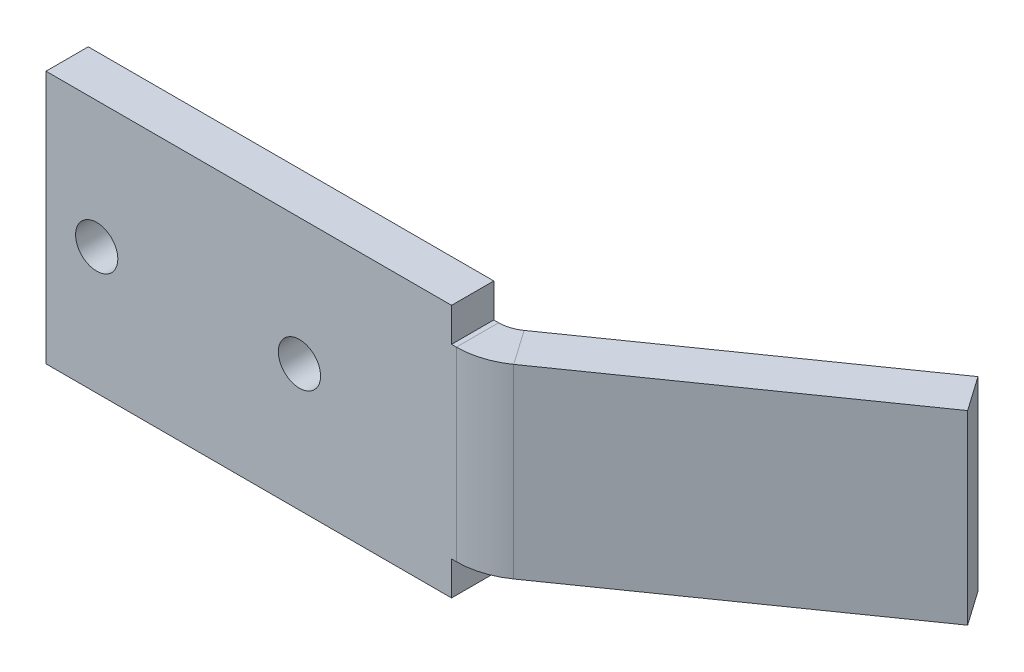
ISO-10303-21;
HEADER;
FILE_DESCRIPTION(('STEP AP214'),'2;1');
FILE_NAME('part.step','',(''),(''),'','','');
FILE_SCHEMA(('AUTOMOTIVE_DESIGN { 1 0 10303 214 1 1 1 1 }'));
ENDSEC;
DATA;
#1=APPLICATION_CONTEXT('core data for automotive mechanical design processes');
#2=APPLICATION_PROTOCOL_DEFINITION('international standard','automotive_design',2000,#1);
#3=PRODUCT_CONTEXT('',#1,'mechanical');
#4=PRODUCT('Part','Part','',(#3));
#5=PRODUCT_RELATED_PRODUCT_CATEGORY('part','',(#4));
#6=PRODUCT_DEFINITION_FORMATION('','',#4);
#7=PRODUCT_DEFINITION_CONTEXT('part definition',#1,'design');
#8=PRODUCT_DEFINITION('design','',#6,#7);
#9=PRODUCT_DEFINITION_SHAPE('','',#8);
#10=(LENGTH_UNIT() NAMED_UNIT(*) SI_UNIT(.MILLI.,.METRE.));
#11=(NAMED_UNIT(*) PLANE_ANGLE_UNIT() SI_UNIT($,.RADIAN.));
#12=(NAMED_UNIT(*) SI_UNIT($,.STERADIAN.) SOLID_ANGLE_UNIT());
#13=UNCERTAINTY_MEASURE_WITH_UNIT(LENGTH_MEASURE(1.E-05),#10,'distance_accuracy_value','');
#14=(GEOMETRIC_REPRESENTATION_CONTEXT(3) GLOBAL_UNCERTAINTY_ASSIGNED_CONTEXT((#13)) GLOBAL_UNIT_ASSIGNED_CONTEXT((#10,
#11,#12)) REPRESENTATION_CONTEXT('',''));
#15=CARTESIAN_POINT('',(0.,0.,0.));
#16=DIRECTION('',(0.,0.,1.));
#17=DIRECTION('',(1.,0.,0.));
#18=AXIS2_PLACEMENT_3D('',#15,#16,#17);
#19=CARTESIAN_POINT('',(6.62285312828795,15.,13.3614630847976));
#20=DIRECTION('',(-0.573576436351047,0.,-0.819152044288991));
#21=DIRECTION('',(-0.819152044288991,0.,0.573576436351047));
#22=AXIS2_PLACEMENT_3D('',#19,#20,#21);
#23=PLANE('',#22);
#24=DIRECTION('',(-0.819152044288991,0.,0.573576436351047));
#25=VECTOR('',#24,1.);
#26=CARTESIAN_POINT('',(26.2825021912237,13.,-0.40437138762749));
#27=LINE('',#26,#25);
#28=CARTESIAN_POINT('',(42.6655430770036,13.,-11.8759001146484));
#29=VERTEX_POINT('',#28);
#30=CARTESIAN_POINT('',(26.8672494136243,13.,-0.813815800699542));
#31=VERTEX_POINT('',#30);
#32=EDGE_CURVE('E57',#29,#31,#27,.T.);
#33=ORIENTED_EDGE('',*,*,#32,.T.);
#34=DIRECTION('',(0.,-1.,0.));
#35=VECTOR('',#34,1.);
#36=CARTESIAN_POINT('',(26.8672494136243,15.,-0.813815800699542));
#37=LINE('',#36,#35);
#38=CARTESIAN_POINT('',(26.8672494136243,2.,-0.813815800699542));
#39=VERTEX_POINT('',#38);
#40=EDGE_CURVE('E49',#31,#39,#37,.T.);
#41=ORIENTED_EDGE('',*,*,#40,.T.);
#42=DIRECTION('',(0.819152044288991,0.,-0.573576436351047));
#43=VECTOR('',#42,1.);
#44=CARTESIAN_POINT('',(26.2825021912237,2.,-0.40437138762749));
#45=LINE('',#44,#43);
#46=CARTESIAN_POINT('',(42.6655430770036,2.,-11.8759001146484));
#47=VERTEX_POINT('',#46);
#48=EDGE_CURVE('E65',#39,#47,#45,.T.);
#49=ORIENTED_EDGE('',*,*,#48,.T.);
#50=DIRECTION('',(0.,1.,0.));
#51=VECTOR('',#50,1.);
#52=CARTESIAN_POINT('',(42.6655430770036,2.,-11.8759001146484));
#53=LINE('',#52,#51);
#54=EDGE_CURVE('E212',#47,#29,#53,.T.);
#55=ORIENTED_EDGE('',*,*,#54,.T.);
#56=EDGE_LOOP('',(#33,#41,#49,#55));
#57=FACE_BOUND('',#56,.T.);
#58=ADVANCED_FACE('F40',(#57),#23,.F.);
#59=CARTESIAN_POINT('',(24.8485611003461,13.,-2.45225149834997));
#60=DIRECTION('',(0.,1.,0.));
#61=DIRECTION('',(0.573576436351047,0.,0.819152044288991));
#62=AXIS2_PLACEMENT_3D('',#59,#60,#61);
#63=PLANE('',#62);
#64=DIRECTION('',(-0.573576436351047,0.,-0.819152044288991));
#65=VECTOR('',#64,1.);
#66=CARTESIAN_POINT('',(25.4333083227467,13.,-2.86169591142202));
#67=LINE('',#66,#65);
#68=CARTESIAN_POINT('',(25.4333083227467,13.,-2.86169591142202));
#69=VERTEX_POINT('',#68);
#70=EDGE_CURVE('E12',#31,#69,#67,.T.);
#71=ORIENTED_EDGE('',*,*,#70,.F.);
#72=ORIENTED_EDGE('',*,*,#32,.F.);
#73=DIRECTION('',(0.573576436351047,0.,0.819152044288991));
#74=VECTOR('',#73,1.);
#75=CARTESIAN_POINT('',(41.2316019861259,13.,-13.9237802253709));
#76=LINE('',#75,#74);
#77=CARTESIAN_POINT('',(41.2316019861259,13.,-13.9237802253709));
#78=VERTEX_POINT('',#77);
#79=EDGE_CURVE('E214',#78,#29,#76,.T.);
#80=ORIENTED_EDGE('',*,*,#79,.F.);
#81=DIRECTION('',(-0.819152044288991,0.,0.573576436351047));
#82=VECTOR('',#81,1.);
#83=CARTESIAN_POINT('',(24.8485611003461,13.,-2.45225149834997));
#84=LINE('',#83,#82);
#85=EDGE_CURVE('E211',#78,#69,#84,.T.);
#86=ORIENTED_EDGE('',*,*,#85,.T.);
#87=EDGE_LOOP('',(#71,#72,#80,#86));
#88=FACE_BOUND('',#87,.T.);
#89=ADVANCED_FACE('F42',(#88),#63,.T.);
#90=CARTESIAN_POINT('',(41.2316019861259,2.,-13.9237802253709));
#91=DIRECTION('',(0.819152044288991,0.,-0.573576436351047));
#92=DIRECTION('',(-0.573576436351047,0.,-0.819152044288991));
#93=AXIS2_PLACEMENT_3D('',#90,#91,#92);
#94=PLANE('',#93);
#95=ORIENTED_EDGE('',*,*,#54,.F.);
#96=DIRECTION('',(0.573576436351047,0.,0.819152044288991));
#97=VECTOR('',#96,1.);
#98=CARTESIAN_POINT('',(41.2316019861259,2.,-13.9237802253709));
#99=LINE('',#98,#97);
#100=CARTESIAN_POINT('',(41.2316019861259,2.,-13.9237802253709));
#101=VERTEX_POINT('',#100);
#102=EDGE_CURVE('E216',#101,#47,#99,.T.);
#103=ORIENTED_EDGE('',*,*,#102,.F.);
#104=DIRECTION('',(0.,1.,0.));
#105=VECTOR('',#104,1.);
#106=CARTESIAN_POINT('',(41.2316019861259,2.,-13.9237802253709));
#107=LINE('',#106,#105);
#108=EDGE_CURVE('E208',#101,#78,#107,.T.);
#109=ORIENTED_EDGE('',*,*,#108,.T.);
#110=ORIENTED_EDGE('',*,*,#79,.T.);
#111=EDGE_LOOP('',(#95,#103,#109,#110));
#112=FACE_BOUND('',#111,.T.);
#113=ADVANCED_FACE('F232',(#112),#94,.T.);
#114=CARTESIAN_POINT('',(24.8485611003461,2.,-2.45225149834997));
#115=DIRECTION('',(0.,-1.,0.));
#116=DIRECTION('',(-0.573576436351047,0.,-0.819152044288991));
#117=AXIS2_PLACEMENT_3D('',#114,#115,#116);
#118=PLANE('',#117);
#119=DIRECTION('',(0.573576436351047,0.,0.819152044288991));
#120=VECTOR('',#119,1.);
#121=CARTESIAN_POINT('',(25.4333083227467,2.,-2.86169591142202));
#122=LINE('',#121,#120);
#123=CARTESIAN_POINT('',(25.4333083227467,2.,-2.86169591142202));
#124=VERTEX_POINT('',#123);
#125=EDGE_CURVE('E219',#124,#39,#122,.T.);
#126=ORIENTED_EDGE('',*,*,#125,.F.);
#127=DIRECTION('',(0.819152044288991,0.,-0.573576436351047));
#128=VECTOR('',#127,1.);
#129=CARTESIAN_POINT('',(24.8485611003461,2.,-2.45225149834997));
#130=LINE('',#129,#128);
#131=EDGE_CURVE('E44',#124,#101,#130,.T.);
#132=ORIENTED_EDGE('',*,*,#131,.T.);
#133=ORIENTED_EDGE('',*,*,#102,.T.);
#134=ORIENTED_EDGE('',*,*,#48,.F.);
#135=EDGE_LOOP('',(#126,#132,#133,#134));
#136=FACE_BOUND('',#135,.T.);
#137=ADVANCED_FACE('F227',(#136),#118,.T.);
#138=CARTESIAN_POINT('',(5.18891203741034,15.,11.3135829740752));
#139=DIRECTION('',(-0.573576436351047,0.,-0.819152044288991));
#140=DIRECTION('',(-0.819152044288991,0.,0.573576436351047));
#141=AXIS2_PLACEMENT_3D('',#138,#139,#140);
#142=PLANE('',#141);
#143=DIRECTION('',(0.,-1.,0.));
#144=VECTOR('',#143,1.);
#145=CARTESIAN_POINT('',(25.4333083227467,15.,-2.86169591142202));
#146=LINE('',#145,#144);
#147=EDGE_CURVE('E153',#69,#124,#146,.T.);
#148=ORIENTED_EDGE('',*,*,#147,.F.);
#149=ORIENTED_EDGE('',*,*,#85,.F.);
#150=ORIENTED_EDGE('',*,*,#108,.F.);
#151=ORIENTED_EDGE('',*,*,#131,.F.);
#152=EDGE_LOOP('',(#148,#149,#150,#151));
#153=FACE_BOUND('',#152,.T.);
#154=ADVANCED_FACE('F234',(#153),#142,.T.);
#155=CARTESIAN_POINT('',(24.,15.,-2.5));
#156=DIRECTION('',(1.,0.,0.));
#157=DIRECTION('',(0.,0.,-1.));
#158=AXIS2_PLACEMENT_3D('',#155,#156,#157);
#159=PLANE('',#158);
#160=DIRECTION('',(0.,1.,0.));
#161=VECTOR('',#160,1.);
#162=CARTESIAN_POINT('',(24.,15.,0.));
#163=LINE('',#162,#161);
#164=CARTESIAN_POINT('',(24.,13.,0.));
#165=VERTEX_POINT('',#164);
#166=CARTESIAN_POINT('',(24.,15.,0.));
#167=VERTEX_POINT('',#166);
#168=EDGE_CURVE('E266',#165,#167,#163,.T.);
#169=ORIENTED_EDGE('',*,*,#168,.F.);
#170=DIRECTION('',(0.,0.,1.));
#171=VECTOR('',#170,1.);
#172=CARTESIAN_POINT('',(24.,13.,-2.5));
#173=LINE('',#172,#171);
#174=CARTESIAN_POINT('',(24.,13.,-2.5));
#175=VERTEX_POINT('',#174);
#176=EDGE_CURVE('E224',#175,#165,#173,.T.);
#177=ORIENTED_EDGE('',*,*,#176,.F.);
#178=DIRECTION('',(0.,1.,0.));
#179=VECTOR('',#178,1.);
#180=CARTESIAN_POINT('',(24.,15.,-2.5));
#181=LINE('',#180,#179);
#182=CARTESIAN_POINT('',(24.,15.,-2.5));
#183=VERTEX_POINT('',#182);
#184=EDGE_CURVE('E204',#175,#183,#181,.T.);
#185=ORIENTED_EDGE('',*,*,#184,.T.);
#186=DIRECTION('',(0.,0.,1.));
#187=VECTOR('',#186,1.);
#188=CARTESIAN_POINT('',(24.,15.,-2.5));
#189=LINE('',#188,#187);
#190=EDGE_CURVE('E202',#183,#167,#189,.T.);
#191=ORIENTED_EDGE('',*,*,#190,.T.);
#192=EDGE_LOOP('',(#169,#177,#185,#191));
#193=FACE_BOUND('',#192,.T.);
#194=ADVANCED_FACE('F279',(#193),#159,.T.);
#195=CARTESIAN_POINT('',(0.,15.,-2.5));
#196=DIRECTION('',(0.,1.,0.));
#197=DIRECTION('',(0.,0.,1.));
#198=AXIS2_PLACEMENT_3D('',#195,#196,#197);
#199=PLANE('',#198);
#200=DIRECTION('',(-1.,0.,0.));
#201=VECTOR('',#200,1.);
#202=CARTESIAN_POINT('',(0.,15.,0.));
#203=LINE('',#202,#201);
#204=CARTESIAN_POINT('',(0.,15.,0.));
#205=VERTEX_POINT('',#204);
#206=EDGE_CURVE('E263',#167,#205,#203,.T.);
#207=ORIENTED_EDGE('',*,*,#206,.F.);
#208=ORIENTED_EDGE('',*,*,#190,.F.);
#209=DIRECTION('',(-1.,0.,0.));
#210=VECTOR('',#209,1.);
#211=CARTESIAN_POINT('',(0.,15.,-2.5));
#212=LINE('',#211,#210);
#213=CARTESIAN_POINT('',(0.,15.,-2.5));
#214=VERTEX_POINT('',#213);
#215=EDGE_CURVE('E199',#183,#214,#212,.T.);
#216=ORIENTED_EDGE('',*,*,#215,.T.);
#217=DIRECTION('',(0.,0.,1.));
#218=VECTOR('',#217,1.);
#219=CARTESIAN_POINT('',(0.,15.,-2.5));
#220=LINE('',#219,#218);
#221=EDGE_CURVE('E197',#214,#205,#220,.T.);
#222=ORIENTED_EDGE('',*,*,#221,.T.);
#223=EDGE_LOOP('',(#207,#208,#216,#222));
#224=FACE_BOUND('',#223,.T.);
#225=ADVANCED_FACE('F282',(#224),#199,.T.);
#226=CARTESIAN_POINT('',(0.,0.,-2.5));
#227=DIRECTION('',(-1.,0.,0.));
#228=DIRECTION('',(0.,0.,1.));
#229=AXIS2_PLACEMENT_3D('',#226,#227,#228);
#230=PLANE('',#229);
#231=DIRECTION('',(0.,-1.,0.));
#232=VECTOR('',#231,1.);
#233=CARTESIAN_POINT('',(0.,0.,0.));
#234=LINE('',#233,#232);
#235=CARTESIAN_POINT('',(0.,0.,0.));
#236=VERTEX_POINT('',#235);
#237=EDGE_CURVE('E260',#205,#236,#234,.T.);
#238=ORIENTED_EDGE('',*,*,#237,.F.);
#239=ORIENTED_EDGE('',*,*,#221,.F.);
#240=DIRECTION('',(0.,-1.,0.));
#241=VECTOR('',#240,1.);
#242=CARTESIAN_POINT('',(0.,0.,-2.5));
#243=LINE('',#242,#241);
#244=CARTESIAN_POINT('',(0.,0.,-2.5));
#245=VERTEX_POINT('',#244);
#246=EDGE_CURVE('E194',#214,#245,#243,.T.);
#247=ORIENTED_EDGE('',*,*,#246,.T.);
#248=DIRECTION('',(0.,0.,1.));
#249=VECTOR('',#248,1.);
#250=CARTESIAN_POINT('',(0.,0.,-2.5));
#251=LINE('',#250,#249);
#252=EDGE_CURVE('E192',#245,#236,#251,.T.);
#253=ORIENTED_EDGE('',*,*,#252,.T.);
#254=EDGE_LOOP('',(#238,#239,#247,#253));
#255=FACE_BOUND('',#254,.T.);
#256=ADVANCED_FACE('F286',(#255),#230,.T.);
#257=CARTESIAN_POINT('',(0.,0.,-2.5));
#258=DIRECTION('',(0.,-1.,0.));
#259=DIRECTION('',(0.,0.,-1.));
#260=AXIS2_PLACEMENT_3D('',#257,#258,#259);
#261=PLANE('',#260);
#262=DIRECTION('',(1.,0.,0.));
#263=VECTOR('',#262,1.);
#264=CARTESIAN_POINT('',(0.,0.,0.));
#265=LINE('',#264,#263);
#266=CARTESIAN_POINT('',(24.,0.,0.));
#267=VERTEX_POINT('',#266);
#268=EDGE_CURVE('E257',#236,#267,#265,.T.);
#269=ORIENTED_EDGE('',*,*,#268,.F.);
#270=ORIENTED_EDGE('',*,*,#252,.F.);
#271=DIRECTION('',(1.,0.,0.));
#272=VECTOR('',#271,1.);
#273=CARTESIAN_POINT('',(0.,0.,-2.5));
#274=LINE('',#273,#272);
#275=CARTESIAN_POINT('',(24.,0.,-2.5));
#276=VERTEX_POINT('',#275);
#277=EDGE_CURVE('E189',#245,#276,#274,.T.);
#278=ORIENTED_EDGE('',*,*,#277,.T.);
#279=DIRECTION('',(0.,0.,1.));
#280=VECTOR('',#279,1.);
#281=CARTESIAN_POINT('',(24.,0.,-2.5));
#282=LINE('',#281,#280);
#283=EDGE_CURVE('E187',#276,#267,#282,.T.);
#284=ORIENTED_EDGE('',*,*,#283,.T.);
#285=EDGE_LOOP('',(#269,#270,#278,#284));
#286=FACE_BOUND('',#285,.T.);
#287=ADVANCED_FACE('F290',(#286),#261,.T.);
#288=CARTESIAN_POINT('',(24.,0.,-2.5));
#289=DIRECTION('',(1.,0.,0.));
#290=DIRECTION('',(0.,0.,-1.));
#291=AXIS2_PLACEMENT_3D('',#288,#289,#290);
#292=PLANE('',#291);
#293=DIRECTION('',(0.,1.,0.));
#294=VECTOR('',#293,1.);
#295=CARTESIAN_POINT('',(24.,0.,0.));
#296=LINE('',#295,#294);
#297=CARTESIAN_POINT('',(24.,2.,0.));
#298=VERTEX_POINT('',#297);
#299=EDGE_CURVE('E254',#267,#298,#296,.T.);
#300=ORIENTED_EDGE('',*,*,#299,.F.);
#301=ORIENTED_EDGE('',*,*,#283,.F.);
#302=DIRECTION('',(0.,1.,0.));
#303=VECTOR('',#302,1.);
#304=CARTESIAN_POINT('',(24.,0.,-2.5));
#305=LINE('',#304,#303);
#306=CARTESIAN_POINT('',(24.,2.,-2.5));
#307=VERTEX_POINT('',#306);
#308=EDGE_CURVE('E185',#276,#307,#305,.T.);
#309=ORIENTED_EDGE('',*,*,#308,.T.);
#310=DIRECTION('',(0.,0.,1.));
#311=VECTOR('',#310,1.);
#312=CARTESIAN_POINT('',(24.,2.,-2.5));
#313=LINE('',#312,#311);
#314=EDGE_CURVE('E169',#307,#298,#313,.T.);
#315=ORIENTED_EDGE('',*,*,#314,.T.);
#316=EDGE_LOOP('',(#300,#301,#309,#315));
#317=FACE_BOUND('',#316,.T.);
#318=ADVANCED_FACE('F293',(#317),#292,.T.);
#319=CARTESIAN_POINT('',(15.,7.5,0.));
#320=DIRECTION('',(0.,0.,1.));
#321=DIRECTION('',(1.,0.,0.));
#322=AXIS2_PLACEMENT_3D('',#319,#320,#321);
#323=CYLINDRICAL_SURFACE('',#322,1.25);
#324=CARTESIAN_POINT('',(15.,7.5,-2.5));
#325=DIRECTION('',(0.,0.,-1.));
#326=DIRECTION('',(-1.,0.,0.));
#327=AXIS2_PLACEMENT_3D('',#324,#325,#326);
#328=CIRCLE('',#327,1.25);
#329=CARTESIAN_POINT('',(13.75,7.5,-2.5));
#330=VERTEX_POINT('',#329);
#331=EDGE_CURVE('E181',#330,#330,#328,.T.);
#332=ORIENTED_EDGE('',*,*,#331,.T.);
#333=EDGE_LOOP('',(#332));
#334=FACE_BOUND('',#333,.T.);
#335=CARTESIAN_POINT('',(15.,7.5,0.));
#336=DIRECTION('',(0.,0.,1.));
#337=DIRECTION('',(1.,0.,0.));
#338=AXIS2_PLACEMENT_3D('',#335,#336,#337);
#339=CIRCLE('',#338,1.25);
#340=CARTESIAN_POINT('',(16.25,7.5,0.));
#341=VERTEX_POINT('',#340);
#342=EDGE_CURVE('E178',#341,#341,#339,.T.);
#343=ORIENTED_EDGE('',*,*,#342,.T.);
#344=EDGE_LOOP('',(#343));
#345=FACE_BOUND('',#344,.T.);
#346=ADVANCED_FACE('F295',(#334,#345),#323,.F.);
#347=CARTESIAN_POINT('',(3.,7.5,0.));
#348=DIRECTION('',(0.,0.,1.));
#349=DIRECTION('',(1.,0.,0.));
#350=AXIS2_PLACEMENT_3D('',#347,#348,#349);
#351=CYLINDRICAL_SURFACE('',#350,1.25);
#352=CARTESIAN_POINT('',(3.,7.5,-2.5));
#353=DIRECTION('',(0.,0.,-1.));
#354=DIRECTION('',(-1.,0.,0.));
#355=AXIS2_PLACEMENT_3D('',#352,#353,#354);
#356=CIRCLE('',#355,1.25);
#357=CARTESIAN_POINT('',(1.75,7.5,-2.5));
#358=VERTEX_POINT('',#357);
#359=EDGE_CURVE('E175',#358,#358,#356,.T.);
#360=ORIENTED_EDGE('',*,*,#359,.T.);
#361=EDGE_LOOP('',(#360));
#362=FACE_BOUND('',#361,.T.);
#363=CARTESIAN_POINT('',(3.,7.5,0.));
#364=DIRECTION('',(0.,0.,1.));
#365=DIRECTION('',(1.,0.,0.));
#366=AXIS2_PLACEMENT_3D('',#363,#364,#365);
#367=CIRCLE('',#366,1.25);
#368=CARTESIAN_POINT('',(4.25,7.5,0.));
#369=VERTEX_POINT('',#368);
#370=EDGE_CURVE('E166',#369,#369,#367,.T.);
#371=ORIENTED_EDGE('',*,*,#370,.T.);
#372=EDGE_LOOP('',(#371));
#373=FACE_BOUND('',#372,.T.);
#374=ADVANCED_FACE('F301',(#362,#373),#351,.F.);
#375=CARTESIAN_POINT('',(0.,15.,-2.5));
#376=DIRECTION('',(0.,0.,-1.));
#377=DIRECTION('',(-1.,0.,0.));
#378=AXIS2_PLACEMENT_3D('',#375,#376,#377);
#379=PLANE('',#378);
#380=ORIENTED_EDGE('',*,*,#359,.F.);
#381=EDGE_LOOP('',(#380));
#382=FACE_BOUND('',#381,.T.);
#383=ORIENTED_EDGE('',*,*,#331,.F.);
#384=EDGE_LOOP('',(#383));
#385=FACE_BOUND('',#384,.T.);
#386=DIRECTION('',(-1.,0.,0.));
#387=VECTOR('',#386,1.);
#388=CARTESIAN_POINT('',(24.,13.,-2.5));
#389=LINE('',#388,#387);
#390=CARTESIAN_POINT('',(24.2861554500446,13.,-2.5));
#391=VERTEX_POINT('',#390);
#392=EDGE_CURVE('E164',#391,#175,#389,.T.);
#393=ORIENTED_EDGE('',*,*,#392,.F.);
#394=DIRECTION('',(0.,-1.,0.));
#395=VECTOR('',#394,1.);
#396=CARTESIAN_POINT('',(24.2861554500446,15.,-2.5));
#397=LINE('',#396,#395);
#398=CARTESIAN_POINT('',(24.2861554500446,2.,-2.5));
#399=VERTEX_POINT('',#398);
#400=EDGE_CURVE('E151',#391,#399,#397,.T.);
#401=ORIENTED_EDGE('',*,*,#400,.T.);
#402=DIRECTION('',(1.,0.,0.));
#403=VECTOR('',#402,1.);
#404=CARTESIAN_POINT('',(24.,2.,-2.5));
#405=LINE('',#404,#403);
#406=EDGE_CURVE('E144',#307,#399,#405,.T.);
#407=ORIENTED_EDGE('',*,*,#406,.F.);
#408=ORIENTED_EDGE('',*,*,#308,.F.);
#409=ORIENTED_EDGE('',*,*,#277,.F.);
#410=ORIENTED_EDGE('',*,*,#246,.F.);
#411=ORIENTED_EDGE('',*,*,#215,.F.);
#412=ORIENTED_EDGE('',*,*,#184,.F.);
#413=EDGE_LOOP('',(#393,#401,#407,#408,#409,#410,#411,#412));
#414=FACE_BOUND('',#413,.T.);
#415=ADVANCED_FACE('F160',(#382,#385,#414),#379,.T.);
#416=CARTESIAN_POINT('',(24.,2.,-2.5));
#417=DIRECTION('',(0.,-1.,0.));
#418=DIRECTION('',(0.,0.,-1.));
#419=AXIS2_PLACEMENT_3D('',#416,#417,#418);
#420=PLANE('',#419);
#421=ORIENTED_EDGE('',*,*,#406,.T.);
#422=DIRECTION('',(0.,0.,1.));
#423=VECTOR('',#422,1.);
#424=CARTESIAN_POINT('',(24.2861554500446,2.,-2.5));
#425=LINE('',#424,#423);
#426=CARTESIAN_POINT('',(24.2861554500446,2.,0.));
#427=VERTEX_POINT('',#426);
#428=EDGE_CURVE('E132',#399,#427,#425,.T.);
#429=ORIENTED_EDGE('',*,*,#428,.T.);
#430=DIRECTION('',(1.,0.,0.));
#431=VECTOR('',#430,1.);
#432=CARTESIAN_POINT('',(24.,2.,0.));
#433=LINE('',#432,#431);
#434=EDGE_CURVE('E251',#298,#427,#433,.T.);
#435=ORIENTED_EDGE('',*,*,#434,.F.);
#436=ORIENTED_EDGE('',*,*,#314,.F.);
#437=EDGE_LOOP('',(#421,#429,#435,#436));
#438=FACE_BOUND('',#437,.T.);
#439=ADVANCED_FACE('F168',(#438),#420,.T.);
#440=CARTESIAN_POINT('',(0.,15.,0.));
#441=DIRECTION('',(0.,0.,-1.));
#442=DIRECTION('',(-1.,0.,0.));
#443=AXIS2_PLACEMENT_3D('',#440,#441,#442);
#444=PLANE('',#443);
#445=DIRECTION('',(0.,-1.,0.));
#446=VECTOR('',#445,1.);
#447=CARTESIAN_POINT('',(24.2861554500446,15.,0.));
#448=LINE('',#447,#446);
#449=CARTESIAN_POINT('',(24.2861554500446,13.,0.));
#450=VERTEX_POINT('',#449);
#451=EDGE_CURVE('E154',#450,#427,#448,.T.);
#452=ORIENTED_EDGE('',*,*,#451,.F.);
#453=DIRECTION('',(-1.,0.,0.));
#454=VECTOR('',#453,1.);
#455=CARTESIAN_POINT('',(24.,13.,0.));
#456=LINE('',#455,#454);
#457=EDGE_CURVE('E143',#450,#165,#456,.T.);
#458=ORIENTED_EDGE('',*,*,#457,.T.);
#459=ORIENTED_EDGE('',*,*,#168,.T.);
#460=ORIENTED_EDGE('',*,*,#206,.T.);
#461=ORIENTED_EDGE('',*,*,#237,.T.);
#462=ORIENTED_EDGE('',*,*,#268,.T.);
#463=ORIENTED_EDGE('',*,*,#299,.T.);
#464=ORIENTED_EDGE('',*,*,#434,.T.);
#465=EDGE_LOOP('',(#452,#458,#459,#460,#461,#462,#463,#464));
#466=FACE_BOUND('',#465,.T.);
#467=ORIENTED_EDGE('',*,*,#370,.F.);
#468=EDGE_LOOP('',(#467));
#469=FACE_BOUND('',#468,.T.);
#470=ORIENTED_EDGE('',*,*,#342,.F.);
#471=EDGE_LOOP('',(#470));
#472=FACE_BOUND('',#471,.T.);
#473=ADVANCED_FACE('F271',(#466,#469,#472),#444,.F.);
#474=CARTESIAN_POINT('',(24.,13.,-2.5));
#475=DIRECTION('',(0.,1.,0.));
#476=DIRECTION('',(0.,0.,1.));
#477=AXIS2_PLACEMENT_3D('',#474,#475,#476);
#478=PLANE('',#477);
#479=ORIENTED_EDGE('',*,*,#457,.F.);
#480=DIRECTION('',(0.,0.,-1.));
#481=VECTOR('',#480,1.);
#482=CARTESIAN_POINT('',(24.2861554500446,13.,-2.5));
#483=LINE('',#482,#481);
#484=EDGE_CURVE('E249',#450,#391,#483,.T.);
#485=ORIENTED_EDGE('',*,*,#484,.T.);
#486=ORIENTED_EDGE('',*,*,#392,.T.);
#487=ORIENTED_EDGE('',*,*,#176,.T.);
#488=EDGE_LOOP('',(#479,#485,#486,#487));
#489=FACE_BOUND('',#488,.T.);
#490=ADVANCED_FACE('F277',(#489),#478,.T.);
#491=CARTESIAN_POINT('',(24.2861554500446,13.,-4.5));
#492=DIRECTION('',(0.,-1.,0.));
#493=DIRECTION('',(0.,0.,-1.));
#494=AXIS2_PLACEMENT_3D('',#491,#492,#493);
#495=PLANE('',#494);
#496=ORIENTED_EDGE('',*,*,#484,.F.);
#497=CARTESIAN_POINT('',(24.2861554500446,13.,-4.5));
#498=DIRECTION('',(0.,-1.,0.));
#499=DIRECTION('',(0.,0.,-1.));
#500=AXIS2_PLACEMENT_3D('',#497,#498,#499);
#501=CIRCLE('',#500,4.5);
#502=EDGE_CURVE('E241',#450,#31,#501,.F.);
#503=ORIENTED_EDGE('',*,*,#502,.T.);
#504=ORIENTED_EDGE('',*,*,#70,.T.);
#505=CARTESIAN_POINT('',(24.2861554500446,13.,-4.5));
#506=DIRECTION('',(0.,1.,0.));
#507=DIRECTION('',(0.,0.,-1.));
#508=AXIS2_PLACEMENT_3D('',#505,#506,#507);
#509=CIRCLE('',#508,2.);
#510=EDGE_CURVE('E155',#391,#69,#509,.T.);
#511=ORIENTED_EDGE('',*,*,#510,.F.);
#512=EDGE_LOOP('',(#496,#503,#504,#511));
#513=FACE_BOUND('',#512,.T.);
#514=ADVANCED_FACE('F239',(#513),#495,.F.);
#515=CARTESIAN_POINT('',(24.2861554500446,2.,-4.5));
#516=DIRECTION('',(0.,1.,0.));
#517=DIRECTION('',(0.,0.,1.));
#518=AXIS2_PLACEMENT_3D('',#515,#516,#517);
#519=PLANE('',#518);
#520=CARTESIAN_POINT('',(24.2861554500446,2.,-4.5));
#521=DIRECTION('',(0.,-1.,0.));
#522=DIRECTION('',(0.,0.,-1.));
#523=AXIS2_PLACEMENT_3D('',#520,#521,#522);
#524=CIRCLE('',#523,4.5);
#525=EDGE_CURVE('E138',#39,#427,#524,.T.);
#526=ORIENTED_EDGE('',*,*,#525,.T.);
#527=ORIENTED_EDGE('',*,*,#428,.F.);
#528=CARTESIAN_POINT('',(24.2861554500446,2.,-4.5));
#529=DIRECTION('',(0.,-1.,0.));
#530=DIRECTION('',(0.,0.,1.));
#531=AXIS2_PLACEMENT_3D('',#528,#529,#530);
#532=CIRCLE('',#531,2.);
#533=EDGE_CURVE('E136',#124,#399,#532,.T.);
#534=ORIENTED_EDGE('',*,*,#533,.F.);
#535=ORIENTED_EDGE('',*,*,#125,.T.);
#536=EDGE_LOOP('',(#526,#527,#534,#535));
#537=FACE_BOUND('',#536,.T.);
#538=ADVANCED_FACE('F134',(#537),#519,.F.);
#539=CARTESIAN_POINT('',(24.2861554500446,18.788618957436,-4.5));
#540=DIRECTION('',(0.,-1.,0.));
#541=DIRECTION('',(0.,0.,-1.));
#542=AXIS2_PLACEMENT_3D('',#539,#540,#541);
#543=CYLINDRICAL_SURFACE('',#542,2.);
#544=ORIENTED_EDGE('',*,*,#147,.T.);
#545=ORIENTED_EDGE('',*,*,#533,.T.);
#546=ORIENTED_EDGE('',*,*,#400,.F.);
#547=ORIENTED_EDGE('',*,*,#510,.T.);
#548=EDGE_LOOP('',(#544,#545,#546,#547));
#549=FACE_BOUND('',#548,.T.);
#550=ADVANCED_FACE('F149',(#549),#543,.F.);
#551=CARTESIAN_POINT('',(24.2861554500446,18.788618957436,-4.5));
#552=DIRECTION('',(0.,-1.,0.));
#553=DIRECTION('',(0.,0.,-1.));
#554=AXIS2_PLACEMENT_3D('',#551,#552,#553);
#555=CYLINDRICAL_SURFACE('',#554,4.5);
#556=ORIENTED_EDGE('',*,*,#40,.F.);
#557=ORIENTED_EDGE('',*,*,#502,.F.);
#558=ORIENTED_EDGE('',*,*,#451,.T.);
#559=ORIENTED_EDGE('',*,*,#525,.F.);
#560=EDGE_LOOP('',(#556,#557,#558,#559));
#561=FACE_BOUND('',#560,.T.);
#562=ADVANCED_FACE('F368',(#561),#555,.T.);
#563=CLOSED_SHELL('',(#58,#89,#113,#137,#154,#194,#225,#256,#287,#318,#346,#374,#415,#439,#473,
#490,#514,#538,#550,#562));
#564=MANIFOLD_SOLID_BREP('B2',#563);
#565=ADVANCED_BREP_SHAPE_REPRESENTATION('',(#18,#564),#14);
#566=SHAPE_DEFINITION_REPRESENTATION(#9,#565);
ENDSEC;
END-ISO-10303-21;
